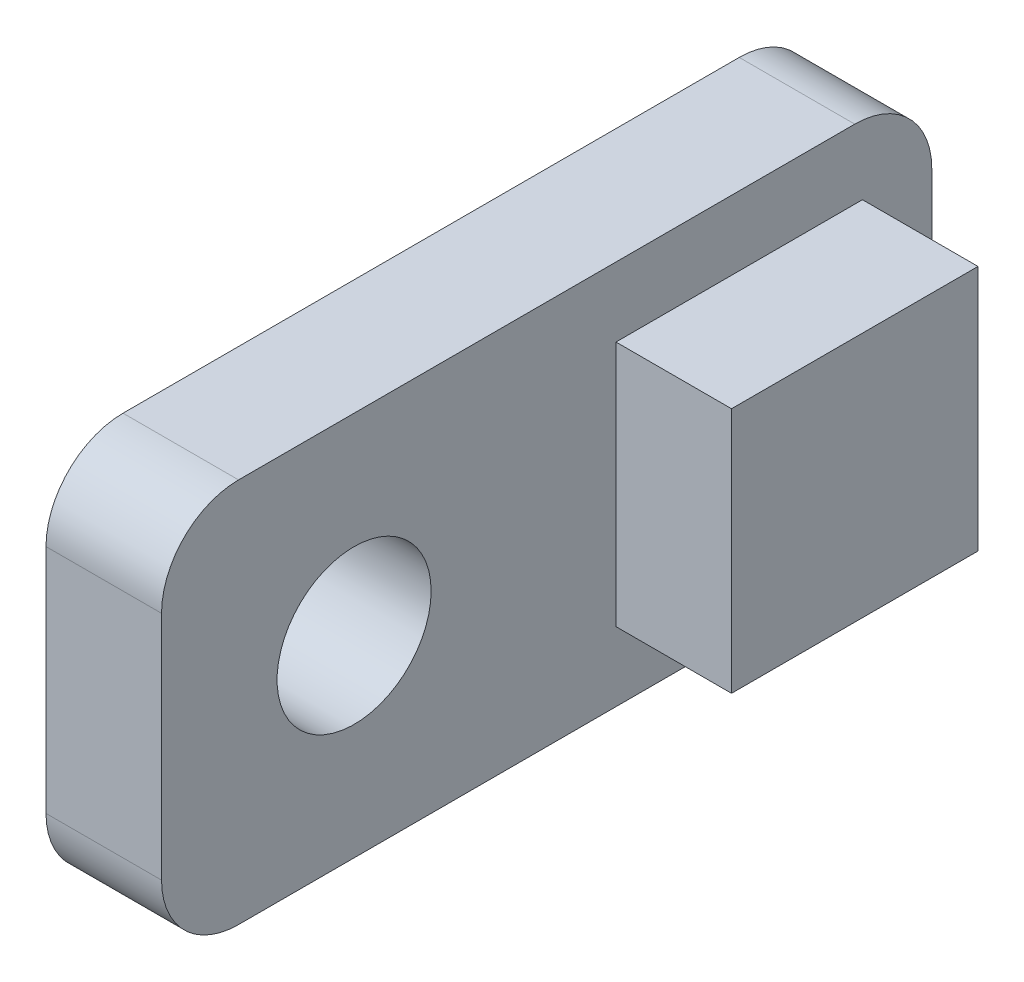
ISO-10303-21;
HEADER;
FILE_DESCRIPTION(('STEP AP214'),'2;1');
FILE_NAME('part.step','',(''),(''),'','','');
FILE_SCHEMA(('AUTOMOTIVE_DESIGN { 1 0 10303 214 1 1 1 1 }'));
ENDSEC;
DATA;
#1=APPLICATION_CONTEXT('core data for automotive mechanical design processes');
#2=APPLICATION_PROTOCOL_DEFINITION('international standard','automotive_design',2000,#1);
#3=PRODUCT_CONTEXT('',#1,'mechanical');
#4=PRODUCT('Part','Part','',(#3));
#5=PRODUCT_RELATED_PRODUCT_CATEGORY('part','',(#4));
#6=PRODUCT_DEFINITION_FORMATION('','',#4);
#7=PRODUCT_DEFINITION_CONTEXT('part definition',#1,'design');
#8=PRODUCT_DEFINITION('design','',#6,#7);
#9=PRODUCT_DEFINITION_SHAPE('','',#8);
#10=(LENGTH_UNIT() NAMED_UNIT(*) SI_UNIT(.MILLI.,.METRE.));
#11=(NAMED_UNIT(*) PLANE_ANGLE_UNIT() SI_UNIT($,.RADIAN.));
#12=(NAMED_UNIT(*) SI_UNIT($,.STERADIAN.) SOLID_ANGLE_UNIT());
#13=UNCERTAINTY_MEASURE_WITH_UNIT(LENGTH_MEASURE(1.E-05),#10,'distance_accuracy_value','');
#14=(GEOMETRIC_REPRESENTATION_CONTEXT(3) GLOBAL_UNCERTAINTY_ASSIGNED_CONTEXT((#13)) GLOBAL_UNIT_ASSIGNED_CONTEXT((#10,
#11,#12)) REPRESENTATION_CONTEXT('',''));
#15=CARTESIAN_POINT('',(0.,0.,0.));
#16=DIRECTION('',(0.,0.,1.));
#17=DIRECTION('',(1.,0.,0.));
#18=AXIS2_PLACEMENT_3D('',#15,#16,#17);
#19=CARTESIAN_POINT('',(3.,0.,0.));
#20=DIRECTION('',(1.,0.,0.));
#21=DIRECTION('',(0.,0.,-1.));
#22=AXIS2_PLACEMENT_3D('',#19,#20,#21);
#23=PLANE('',#22);
#24=CARTESIAN_POINT('',(3.,0.,5.));
#25=DIRECTION('',(1.,0.,0.));
#26=DIRECTION('',(0.,0.,-1.));
#27=AXIS2_PLACEMENT_3D('',#24,#25,#26);
#28=CIRCLE('',#27,2.);
#29=CARTESIAN_POINT('',(3.,0.,3.));
#30=VERTEX_POINT('',#29);
#31=EDGE_CURVE('E156',#30,#30,#28,.T.);
#32=ORIENTED_EDGE('',*,*,#31,.F.);
#33=EDGE_LOOP('',(#32));
#34=FACE_BOUND('',#33,.T.);
#35=DIRECTION('',(0.,0.,1.));
#36=VECTOR('',#35,1.);
#37=CARTESIAN_POINT('',(3.,5.,0.));
#38=LINE('',#37,#36);
#39=CARTESIAN_POINT('',(3.,5.,-7.99999999999999));
#40=VERTEX_POINT('',#39);
#41=CARTESIAN_POINT('',(3.,5.,7.99999999999999));
#42=VERTEX_POINT('',#41);
#43=EDGE_CURVE('E159',#40,#42,#38,.T.);
#44=ORIENTED_EDGE('',*,*,#43,.T.);
#45=CARTESIAN_POINT('',(3.,3.,8.));
#46=DIRECTION('',(1.,0.,0.));
#47=DIRECTION('',(0.,0.,-1.));
#48=AXIS2_PLACEMENT_3D('',#45,#46,#47);
#49=CIRCLE('',#48,2.);
#50=CARTESIAN_POINT('',(3.,2.99999999999998,10.));
#51=VERTEX_POINT('',#50);
#52=EDGE_CURVE('E163',#42,#51,#49,.T.);
#53=ORIENTED_EDGE('',*,*,#52,.T.);
#54=DIRECTION('',(0.,1.,0.));
#55=VECTOR('',#54,1.);
#56=CARTESIAN_POINT('',(3.,0.,10.));
#57=LINE('',#56,#55);
#58=CARTESIAN_POINT('',(3.,-2.99999999999999,10.));
#59=VERTEX_POINT('',#58);
#60=EDGE_CURVE('E165',#59,#51,#57,.T.);
#61=ORIENTED_EDGE('',*,*,#60,.F.);
#62=CARTESIAN_POINT('',(3.,-3.,8.));
#63=DIRECTION('',(1.,0.,0.));
#64=DIRECTION('',(0.,0.,-1.));
#65=AXIS2_PLACEMENT_3D('',#62,#63,#64);
#66=CIRCLE('',#65,2.);
#67=CARTESIAN_POINT('',(3.,-5.,7.99999999999999));
#68=VERTEX_POINT('',#67);
#69=EDGE_CURVE('E168',#68,#59,#66,.F.);
#70=ORIENTED_EDGE('',*,*,#69,.F.);
#71=DIRECTION('',(0.,0.,1.));
#72=VECTOR('',#71,1.);
#73=CARTESIAN_POINT('',(3.,-5.,0.));
#74=LINE('',#73,#72);
#75=CARTESIAN_POINT('',(3.,-5.,-7.99999999999999));
#76=VERTEX_POINT('',#75);
#77=EDGE_CURVE('E171',#76,#68,#74,.T.);
#78=ORIENTED_EDGE('',*,*,#77,.F.);
#79=CARTESIAN_POINT('',(3.,-3.,-8.00000000000001));
#80=DIRECTION('',(1.,0.,0.));
#81=DIRECTION('',(0.,0.,-1.));
#82=AXIS2_PLACEMENT_3D('',#79,#80,#81);
#83=CIRCLE('',#82,2.);
#84=CARTESIAN_POINT('',(3.,-2.99999999999999,-10.));
#85=VERTEX_POINT('',#84);
#86=EDGE_CURVE('E174',#85,#76,#83,.F.);
#87=ORIENTED_EDGE('',*,*,#86,.F.);
#88=DIRECTION('',(0.,1.,0.));
#89=VECTOR('',#88,1.);
#90=CARTESIAN_POINT('',(3.,0.,-10.));
#91=LINE('',#90,#89);
#92=CARTESIAN_POINT('',(3.,2.99999999999999,-10.));
#93=VERTEX_POINT('',#92);
#94=EDGE_CURVE('E177',#85,#93,#91,.T.);
#95=ORIENTED_EDGE('',*,*,#94,.T.);
#96=CARTESIAN_POINT('',(3.,3.,-8.));
#97=DIRECTION('',(1.,0.,0.));
#98=DIRECTION('',(0.,0.,-1.));
#99=AXIS2_PLACEMENT_3D('',#96,#97,#98);
#100=CIRCLE('',#99,2.);
#101=EDGE_CURVE('E179',#93,#40,#100,.T.);
#102=ORIENTED_EDGE('',*,*,#101,.T.);
#103=EDGE_LOOP('',(#44,#53,#61,#70,#78,#87,#95,#102));
#104=FACE_BOUND('',#103,.T.);
#105=DIRECTION('',(0.,-1.,0.));
#106=VECTOR('',#105,1.);
#107=CARTESIAN_POINT('',(3.,0.,-8.2));
#108=LINE('',#107,#106);
#109=CARTESIAN_POINT('',(3.,3.2,-8.2));
#110=VERTEX_POINT('',#109);
#111=CARTESIAN_POINT('',(3.,-3.2,-8.2));
#112=VERTEX_POINT('',#111);
#113=EDGE_CURVE('E49',#110,#112,#108,.T.);
#114=ORIENTED_EDGE('',*,*,#113,.T.);
#115=DIRECTION('',(0.,0.,1.));
#116=VECTOR('',#115,1.);
#117=CARTESIAN_POINT('',(3.,-3.2,0.));
#118=LINE('',#117,#116);
#119=CARTESIAN_POINT('',(3.,-3.2,-1.8));
#120=VERTEX_POINT('',#119);
#121=EDGE_CURVE('E143',#112,#120,#118,.T.);
#122=ORIENTED_EDGE('',*,*,#121,.T.);
#123=DIRECTION('',(0.,-1.,0.));
#124=VECTOR('',#123,1.);
#125=CARTESIAN_POINT('',(3.,0.,-1.8));
#126=LINE('',#125,#124);
#127=CARTESIAN_POINT('',(3.,3.2,-1.8));
#128=VERTEX_POINT('',#127);
#129=EDGE_CURVE('E144',#128,#120,#126,.T.);
#130=ORIENTED_EDGE('',*,*,#129,.F.);
#131=DIRECTION('',(0.,0.,1.));
#132=VECTOR('',#131,1.);
#133=CARTESIAN_POINT('',(3.,3.2,0.));
#134=LINE('',#133,#132);
#135=EDGE_CURVE('E54',#110,#128,#134,.T.);
#136=ORIENTED_EDGE('',*,*,#135,.F.);
#137=EDGE_LOOP('',(#114,#122,#130,#136));
#138=FACE_BOUND('',#137,.T.);
#139=ADVANCED_FACE('F34',(#34,#104,#138),#23,.T.);
#140=CARTESIAN_POINT('',(3.,5.,0.));
#141=DIRECTION('',(0.,-1.,0.));
#142=DIRECTION('',(0.,0.,-1.));
#143=AXIS2_PLACEMENT_3D('',#140,#141,#142);
#144=PLANE('',#143);
#145=DIRECTION('',(0.,0.,1.));
#146=VECTOR('',#145,1.);
#147=CARTESIAN_POINT('',(0.,5.,0.));
#148=LINE('',#147,#146);
#149=CARTESIAN_POINT('',(0.,5.,-7.99999999999999));
#150=VERTEX_POINT('',#149);
#151=CARTESIAN_POINT('',(0.,5.,7.99999999999999));
#152=VERTEX_POINT('',#151);
#153=EDGE_CURVE('E184',#150,#152,#148,.T.);
#154=ORIENTED_EDGE('',*,*,#153,.T.);
#155=DIRECTION('',(-1.,0.,0.));
#156=VECTOR('',#155,1.);
#157=CARTESIAN_POINT('',(3.,5.,7.99999999999999));
#158=LINE('',#157,#156);
#159=EDGE_CURVE('E11',#42,#152,#158,.T.);
#160=ORIENTED_EDGE('',*,*,#159,.F.);
#161=ORIENTED_EDGE('',*,*,#43,.F.);
#162=DIRECTION('',(-1.,0.,0.));
#163=VECTOR('',#162,1.);
#164=CARTESIAN_POINT('',(3.,5.,-7.99999999999999));
#165=LINE('',#164,#163);
#166=EDGE_CURVE('E181',#40,#150,#165,.T.);
#167=ORIENTED_EDGE('',*,*,#166,.T.);
#168=EDGE_LOOP('',(#154,#160,#161,#167));
#169=FACE_BOUND('',#168,.T.);
#170=ADVANCED_FACE('F240',(#169),#144,.F.);
#171=CARTESIAN_POINT('',(3.,3.,8.));
#172=DIRECTION('',(-1.,0.,0.));
#173=DIRECTION('',(0.,0.,1.));
#174=AXIS2_PLACEMENT_3D('',#171,#172,#173);
#175=CYLINDRICAL_SURFACE('',#174,2.);
#176=CARTESIAN_POINT('',(0.,3.,8.));
#177=DIRECTION('',(1.,0.,0.));
#178=DIRECTION('',(0.,0.,-1.));
#179=AXIS2_PLACEMENT_3D('',#176,#177,#178);
#180=CIRCLE('',#179,2.);
#181=CARTESIAN_POINT('',(0.,2.99999999999998,10.));
#182=VERTEX_POINT('',#181);
#183=EDGE_CURVE('E187',#152,#182,#180,.T.);
#184=ORIENTED_EDGE('',*,*,#183,.T.);
#185=DIRECTION('',(-1.,0.,0.));
#186=VECTOR('',#185,1.);
#187=CARTESIAN_POINT('',(3.,2.99999999999998,10.));
#188=LINE('',#187,#186);
#189=EDGE_CURVE('E42',#51,#182,#188,.T.);
#190=ORIENTED_EDGE('',*,*,#189,.F.);
#191=ORIENTED_EDGE('',*,*,#52,.F.);
#192=ORIENTED_EDGE('',*,*,#159,.T.);
#193=EDGE_LOOP('',(#184,#190,#191,#192));
#194=FACE_BOUND('',#193,.T.);
#195=ADVANCED_FACE('F223',(#194),#175,.T.);
#196=CARTESIAN_POINT('',(3.,0.,10.));
#197=DIRECTION('',(0.,0.,1.));
#198=DIRECTION('',(0.,-1.,0.));
#199=AXIS2_PLACEMENT_3D('',#196,#197,#198);
#200=PLANE('',#199);
#201=DIRECTION('',(0.,1.,0.));
#202=VECTOR('',#201,1.);
#203=CARTESIAN_POINT('',(0.,0.,10.));
#204=LINE('',#203,#202);
#205=CARTESIAN_POINT('',(0.,-2.99999999999999,10.));
#206=VERTEX_POINT('',#205);
#207=EDGE_CURVE('E190',#206,#182,#204,.T.);
#208=ORIENTED_EDGE('',*,*,#207,.F.);
#209=DIRECTION('',(-1.,0.,0.));
#210=VECTOR('',#209,1.);
#211=CARTESIAN_POINT('',(3.,-2.99999999999999,10.));
#212=LINE('',#211,#210);
#213=EDGE_CURVE('E216',#59,#206,#212,.T.);
#214=ORIENTED_EDGE('',*,*,#213,.F.);
#215=ORIENTED_EDGE('',*,*,#60,.T.);
#216=ORIENTED_EDGE('',*,*,#189,.T.);
#217=EDGE_LOOP('',(#208,#214,#215,#216));
#218=FACE_BOUND('',#217,.T.);
#219=ADVANCED_FACE('F220',(#218),#200,.T.);
#220=CARTESIAN_POINT('',(3.,-3.,8.));
#221=DIRECTION('',(-1.,0.,0.));
#222=DIRECTION('',(0.,0.,1.));
#223=AXIS2_PLACEMENT_3D('',#220,#221,#222);
#224=CYLINDRICAL_SURFACE('',#223,2.);
#225=CARTESIAN_POINT('',(0.,-3.,8.));
#226=DIRECTION('',(1.,0.,0.));
#227=DIRECTION('',(0.,0.,-1.));
#228=AXIS2_PLACEMENT_3D('',#225,#226,#227);
#229=CIRCLE('',#228,2.);
#230=CARTESIAN_POINT('',(0.,-5.,7.99999999999999));
#231=VERTEX_POINT('',#230);
#232=EDGE_CURVE('E193',#231,#206,#229,.F.);
#233=ORIENTED_EDGE('',*,*,#232,.F.);
#234=DIRECTION('',(-1.,0.,0.));
#235=VECTOR('',#234,1.);
#236=CARTESIAN_POINT('',(3.,-5.,7.99999999999999));
#237=LINE('',#236,#235);
#238=EDGE_CURVE('E214',#68,#231,#237,.T.);
#239=ORIENTED_EDGE('',*,*,#238,.F.);
#240=ORIENTED_EDGE('',*,*,#69,.T.);
#241=ORIENTED_EDGE('',*,*,#213,.T.);
#242=EDGE_LOOP('',(#233,#239,#240,#241));
#243=FACE_BOUND('',#242,.T.);
#244=ADVANCED_FACE('F232',(#243),#224,.T.);
#245=CARTESIAN_POINT('',(3.,-5.,0.));
#246=DIRECTION('',(0.,-1.,0.));
#247=DIRECTION('',(0.,0.,-1.));
#248=AXIS2_PLACEMENT_3D('',#245,#246,#247);
#249=PLANE('',#248);
#250=DIRECTION('',(0.,0.,1.));
#251=VECTOR('',#250,1.);
#252=CARTESIAN_POINT('',(0.,-5.,0.));
#253=LINE('',#252,#251);
#254=CARTESIAN_POINT('',(0.,-5.,-7.99999999999999));
#255=VERTEX_POINT('',#254);
#256=EDGE_CURVE('E196',#255,#231,#253,.T.);
#257=ORIENTED_EDGE('',*,*,#256,.F.);
#258=DIRECTION('',(-1.,0.,0.));
#259=VECTOR('',#258,1.);
#260=CARTESIAN_POINT('',(3.,-5.,-7.99999999999999));
#261=LINE('',#260,#259);
#262=EDGE_CURVE('E212',#76,#255,#261,.T.);
#263=ORIENTED_EDGE('',*,*,#262,.F.);
#264=ORIENTED_EDGE('',*,*,#77,.T.);
#265=ORIENTED_EDGE('',*,*,#238,.T.);
#266=EDGE_LOOP('',(#257,#263,#264,#265));
#267=FACE_BOUND('',#266,.T.);
#268=ADVANCED_FACE('F254',(#267),#249,.T.);
#269=CARTESIAN_POINT('',(3.,-3.,-8.00000000000001));
#270=DIRECTION('',(-1.,0.,0.));
#271=DIRECTION('',(0.,0.,1.));
#272=AXIS2_PLACEMENT_3D('',#269,#270,#271);
#273=CYLINDRICAL_SURFACE('',#272,2.);
#274=CARTESIAN_POINT('',(0.,-3.,-8.00000000000001));
#275=DIRECTION('',(1.,0.,0.));
#276=DIRECTION('',(0.,0.,-1.));
#277=AXIS2_PLACEMENT_3D('',#274,#275,#276);
#278=CIRCLE('',#277,2.);
#279=CARTESIAN_POINT('',(0.,-2.99999999999999,-10.));
#280=VERTEX_POINT('',#279);
#281=EDGE_CURVE('E199',#280,#255,#278,.F.);
#282=ORIENTED_EDGE('',*,*,#281,.F.);
#283=DIRECTION('',(-1.,0.,0.));
#284=VECTOR('',#283,1.);
#285=CARTESIAN_POINT('',(3.,-2.99999999999999,-10.));
#286=LINE('',#285,#284);
#287=EDGE_CURVE('E210',#85,#280,#286,.T.);
#288=ORIENTED_EDGE('',*,*,#287,.F.);
#289=ORIENTED_EDGE('',*,*,#86,.T.);
#290=ORIENTED_EDGE('',*,*,#262,.T.);
#291=EDGE_LOOP('',(#282,#288,#289,#290));
#292=FACE_BOUND('',#291,.T.);
#293=ADVANCED_FACE('F252',(#292),#273,.T.);
#294=CARTESIAN_POINT('',(3.,0.,-10.));
#295=DIRECTION('',(0.,0.,1.));
#296=DIRECTION('',(0.,-1.,0.));
#297=AXIS2_PLACEMENT_3D('',#294,#295,#296);
#298=PLANE('',#297);
#299=DIRECTION('',(0.,1.,0.));
#300=VECTOR('',#299,1.);
#301=CARTESIAN_POINT('',(0.,0.,-10.));
#302=LINE('',#301,#300);
#303=CARTESIAN_POINT('',(0.,2.99999999999999,-10.));
#304=VERTEX_POINT('',#303);
#305=EDGE_CURVE('E202',#280,#304,#302,.T.);
#306=ORIENTED_EDGE('',*,*,#305,.T.);
#307=DIRECTION('',(-1.,0.,0.));
#308=VECTOR('',#307,1.);
#309=CARTESIAN_POINT('',(3.,2.99999999999999,-10.));
#310=LINE('',#309,#308);
#311=EDGE_CURVE('E207',#93,#304,#310,.T.);
#312=ORIENTED_EDGE('',*,*,#311,.F.);
#313=ORIENTED_EDGE('',*,*,#94,.F.);
#314=ORIENTED_EDGE('',*,*,#287,.T.);
#315=EDGE_LOOP('',(#306,#312,#313,#314));
#316=FACE_BOUND('',#315,.T.);
#317=ADVANCED_FACE('F249',(#316),#298,.F.);
#318=CARTESIAN_POINT('',(3.,0.,5.));
#319=DIRECTION('',(-1.,0.,0.));
#320=DIRECTION('',(0.,0.,1.));
#321=AXIS2_PLACEMENT_3D('',#318,#319,#320);
#322=CYLINDRICAL_SURFACE('',#321,2.);
#323=ORIENTED_EDGE('',*,*,#31,.T.);
#324=EDGE_LOOP('',(#323));
#325=FACE_BOUND('',#324,.T.);
#326=CARTESIAN_POINT('',(0.,0.,5.));
#327=DIRECTION('',(1.,0.,0.));
#328=DIRECTION('',(0.,0.,-1.));
#329=AXIS2_PLACEMENT_3D('',#326,#327,#328);
#330=CIRCLE('',#329,2.);
#331=CARTESIAN_POINT('',(0.,0.,3.));
#332=VERTEX_POINT('',#331);
#333=EDGE_CURVE('E155',#332,#332,#330,.T.);
#334=ORIENTED_EDGE('',*,*,#333,.F.);
#335=EDGE_LOOP('',(#334));
#336=FACE_BOUND('',#335,.T.);
#337=ADVANCED_FACE('F36',(#325,#336),#322,.F.);
#338=CARTESIAN_POINT('',(3.,3.,-8.));
#339=DIRECTION('',(-1.,0.,0.));
#340=DIRECTION('',(0.,0.,1.));
#341=AXIS2_PLACEMENT_3D('',#338,#339,#340);
#342=CYLINDRICAL_SURFACE('',#341,2.);
#343=CARTESIAN_POINT('',(0.,3.,-8.));
#344=DIRECTION('',(1.,0.,0.));
#345=DIRECTION('',(0.,0.,-1.));
#346=AXIS2_PLACEMENT_3D('',#343,#344,#345);
#347=CIRCLE('',#346,2.);
#348=EDGE_CURVE('E160',#304,#150,#347,.T.);
#349=ORIENTED_EDGE('',*,*,#348,.T.);
#350=ORIENTED_EDGE('',*,*,#166,.F.);
#351=ORIENTED_EDGE('',*,*,#101,.F.);
#352=ORIENTED_EDGE('',*,*,#311,.T.);
#353=EDGE_LOOP('',(#349,#350,#351,#352));
#354=FACE_BOUND('',#353,.T.);
#355=ADVANCED_FACE('F245',(#354),#342,.T.);
#356=CARTESIAN_POINT('',(0.,0.,0.));
#357=DIRECTION('',(1.,0.,0.));
#358=DIRECTION('',(0.,0.,-1.));
#359=AXIS2_PLACEMENT_3D('',#356,#357,#358);
#360=PLANE('',#359);
#361=ORIENTED_EDGE('',*,*,#153,.F.);
#362=ORIENTED_EDGE('',*,*,#348,.F.);
#363=ORIENTED_EDGE('',*,*,#305,.F.);
#364=ORIENTED_EDGE('',*,*,#281,.T.);
#365=ORIENTED_EDGE('',*,*,#256,.T.);
#366=ORIENTED_EDGE('',*,*,#232,.T.);
#367=ORIENTED_EDGE('',*,*,#207,.T.);
#368=ORIENTED_EDGE('',*,*,#183,.F.);
#369=EDGE_LOOP('',(#361,#362,#363,#364,#365,#366,#367,#368));
#370=FACE_BOUND('',#369,.T.);
#371=ORIENTED_EDGE('',*,*,#333,.T.);
#372=EDGE_LOOP('',(#371));
#373=FACE_BOUND('',#372,.T.);
#374=ADVANCED_FACE('F227',(#370,#373),#360,.F.);
#375=CARTESIAN_POINT('',(6.,-3.2,0.));
#376=DIRECTION('',(0.,1.,0.));
#377=DIRECTION('',(0.,0.,1.));
#378=AXIS2_PLACEMENT_3D('',#375,#376,#377);
#379=PLANE('',#378);
#380=ORIENTED_EDGE('',*,*,#121,.F.);
#381=DIRECTION('',(-1.,0.,0.));
#382=VECTOR('',#381,1.);
#383=CARTESIAN_POINT('',(6.,-3.2,-8.2));
#384=LINE('',#383,#382);
#385=CARTESIAN_POINT('',(6.,-3.2,-8.2));
#386=VERTEX_POINT('',#385);
#387=EDGE_CURVE('E125',#386,#112,#384,.T.);
#388=ORIENTED_EDGE('',*,*,#387,.F.);
#389=DIRECTION('',(0.,0.,-1.));
#390=VECTOR('',#389,1.);
#391=CARTESIAN_POINT('',(6.,-3.2,0.));
#392=LINE('',#391,#390);
#393=CARTESIAN_POINT('',(6.,-3.2,-1.8));
#394=VERTEX_POINT('',#393);
#395=EDGE_CURVE('E132',#394,#386,#392,.T.);
#396=ORIENTED_EDGE('',*,*,#395,.F.);
#397=DIRECTION('',(-1.,0.,0.));
#398=VECTOR('',#397,1.);
#399=CARTESIAN_POINT('',(6.,-3.2,-1.8));
#400=LINE('',#399,#398);
#401=EDGE_CURVE('E391',#394,#120,#400,.T.);
#402=ORIENTED_EDGE('',*,*,#401,.T.);
#403=EDGE_LOOP('',(#380,#388,#396,#402));
#404=FACE_BOUND('',#403,.T.);
#405=ADVANCED_FACE('F142',(#404),#379,.F.);
#406=CARTESIAN_POINT('',(6.,0.,-8.2));
#407=DIRECTION('',(0.,0.,1.));
#408=DIRECTION('',(1.,0.,0.));
#409=AXIS2_PLACEMENT_3D('',#406,#407,#408);
#410=PLANE('',#409);
#411=ORIENTED_EDGE('',*,*,#113,.F.);
#412=DIRECTION('',(-1.,0.,0.));
#413=VECTOR('',#412,1.);
#414=CARTESIAN_POINT('',(6.,3.2,-8.2));
#415=LINE('',#414,#413);
#416=CARTESIAN_POINT('',(6.,3.2,-8.2));
#417=VERTEX_POINT('',#416);
#418=EDGE_CURVE('E127',#417,#110,#415,.T.);
#419=ORIENTED_EDGE('',*,*,#418,.F.);
#420=DIRECTION('',(0.,1.,0.));
#421=VECTOR('',#420,1.);
#422=CARTESIAN_POINT('',(6.,0.,-8.2));
#423=LINE('',#422,#421);
#424=EDGE_CURVE('E121',#386,#417,#423,.T.);
#425=ORIENTED_EDGE('',*,*,#424,.F.);
#426=ORIENTED_EDGE('',*,*,#387,.T.);
#427=EDGE_LOOP('',(#411,#419,#425,#426));
#428=FACE_BOUND('',#427,.T.);
#429=ADVANCED_FACE('F123',(#428),#410,.F.);
#430=CARTESIAN_POINT('',(6.,3.2,0.));
#431=DIRECTION('',(0.,1.,0.));
#432=DIRECTION('',(0.,0.,1.));
#433=AXIS2_PLACEMENT_3D('',#430,#431,#432);
#434=PLANE('',#433);
#435=ORIENTED_EDGE('',*,*,#418,.T.);
#436=ORIENTED_EDGE('',*,*,#135,.T.);
#437=DIRECTION('',(-1.,0.,0.));
#438=VECTOR('',#437,1.);
#439=CARTESIAN_POINT('',(6.,3.2,-1.8));
#440=LINE('',#439,#438);
#441=CARTESIAN_POINT('',(6.,3.2,-1.8));
#442=VERTEX_POINT('',#441);
#443=EDGE_CURVE('E148',#442,#128,#440,.T.);
#444=ORIENTED_EDGE('',*,*,#443,.F.);
#445=DIRECTION('',(0.,0.,-1.));
#446=VECTOR('',#445,1.);
#447=CARTESIAN_POINT('',(6.,3.2,0.));
#448=LINE('',#447,#446);
#449=EDGE_CURVE('E131',#442,#417,#448,.T.);
#450=ORIENTED_EDGE('',*,*,#449,.T.);
#451=EDGE_LOOP('',(#435,#436,#444,#450));
#452=FACE_BOUND('',#451,.T.);
#453=ADVANCED_FACE('F305',(#452),#434,.T.);
#454=CARTESIAN_POINT('',(6.,0.,-1.8));
#455=DIRECTION('',(0.,0.,1.));
#456=DIRECTION('',(1.,0.,0.));
#457=AXIS2_PLACEMENT_3D('',#454,#455,#456);
#458=PLANE('',#457);
#459=ORIENTED_EDGE('',*,*,#443,.T.);
#460=ORIENTED_EDGE('',*,*,#129,.T.);
#461=ORIENTED_EDGE('',*,*,#401,.F.);
#462=DIRECTION('',(0.,1.,0.));
#463=VECTOR('',#462,1.);
#464=CARTESIAN_POINT('',(6.,0.,-1.8));
#465=LINE('',#464,#463);
#466=EDGE_CURVE('E138',#394,#442,#465,.T.);
#467=ORIENTED_EDGE('',*,*,#466,.T.);
#468=EDGE_LOOP('',(#459,#460,#461,#467));
#469=FACE_BOUND('',#468,.T.);
#470=ADVANCED_FACE('F311',(#469),#458,.T.);
#471=CARTESIAN_POINT('',(6.,0.,0.));
#472=DIRECTION('',(1.,0.,0.));
#473=DIRECTION('',(0.,0.,-1.));
#474=AXIS2_PLACEMENT_3D('',#471,#472,#473);
#475=PLANE('',#474);
#476=ORIENTED_EDGE('',*,*,#395,.T.);
#477=ORIENTED_EDGE('',*,*,#424,.T.);
#478=ORIENTED_EDGE('',*,*,#449,.F.);
#479=ORIENTED_EDGE('',*,*,#466,.F.);
#480=EDGE_LOOP('',(#476,#477,#478,#479));
#481=FACE_BOUND('',#480,.T.);
#482=ADVANCED_FACE('F136',(#481),#475,.T.);
#483=CLOSED_SHELL('',(#139,#170,#195,#219,#244,#268,#293,#317,#337,#355,#374,#405,#429,#453,
#470,#482));
#484=MANIFOLD_SOLID_BREP('B2',#483);
#485=ADVANCED_BREP_SHAPE_REPRESENTATION('',(#18,#484),#14);
#486=SHAPE_DEFINITION_REPRESENTATION(#9,#485);
ENDSEC;
END-ISO-10303-21;
